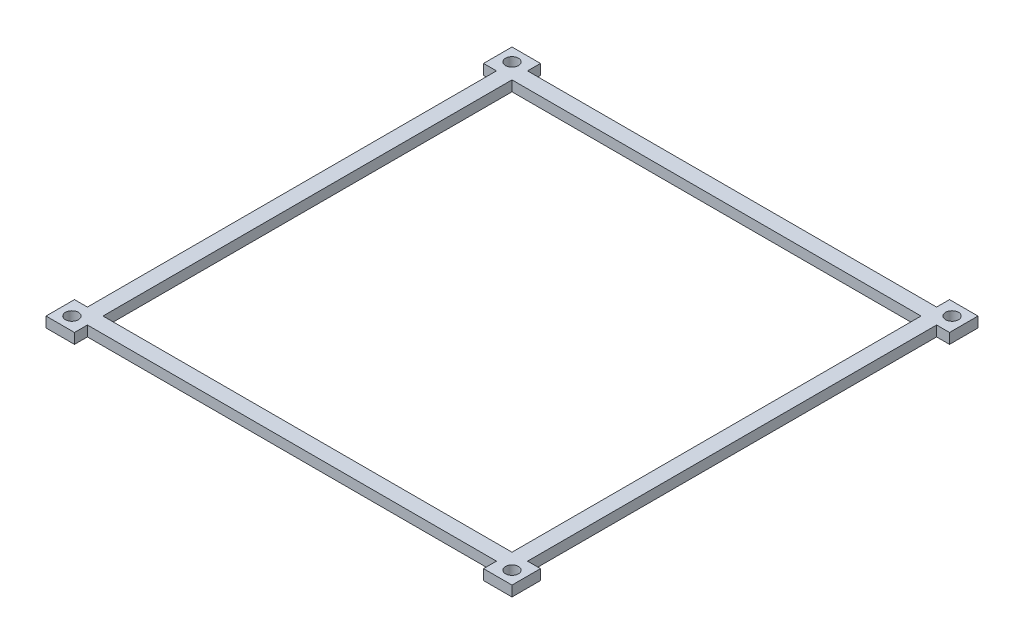
ISO-10303-21;
HEADER;
FILE_DESCRIPTION(('STEP AP214'),'2;1');
FILE_NAME('part.step','',(''),(''),'','','');
FILE_SCHEMA(('AUTOMOTIVE_DESIGN { 1 0 10303 214 1 1 1 1 }'));
ENDSEC;
DATA;
#1=APPLICATION_CONTEXT('core data for automotive mechanical design processes');
#2=APPLICATION_PROTOCOL_DEFINITION('international standard','automotive_design',2000,#1);
#3=PRODUCT_CONTEXT('',#1,'mechanical');
#4=PRODUCT('Part','Part','',(#3));
#5=PRODUCT_RELATED_PRODUCT_CATEGORY('part','',(#4));
#6=PRODUCT_DEFINITION_FORMATION('','',#4);
#7=PRODUCT_DEFINITION_CONTEXT('part definition',#1,'design');
#8=PRODUCT_DEFINITION('design','',#6,#7);
#9=PRODUCT_DEFINITION_SHAPE('','',#8);
#10=(LENGTH_UNIT() NAMED_UNIT(*) SI_UNIT(.MILLI.,.METRE.));
#11=(NAMED_UNIT(*) PLANE_ANGLE_UNIT() SI_UNIT($,.RADIAN.));
#12=(NAMED_UNIT(*) SI_UNIT($,.STERADIAN.) SOLID_ANGLE_UNIT());
#13=UNCERTAINTY_MEASURE_WITH_UNIT(LENGTH_MEASURE(1.E-05),#10,'distance_accuracy_value','');
#14=(GEOMETRIC_REPRESENTATION_CONTEXT(3) GLOBAL_UNCERTAINTY_ASSIGNED_CONTEXT((#13)) GLOBAL_UNIT_ASSIGNED_CONTEXT((#10,
#11,#12)) REPRESENTATION_CONTEXT('',''));
#15=CARTESIAN_POINT('',(0.,0.,0.));
#16=DIRECTION('',(0.,0.,1.));
#17=DIRECTION('',(1.,0.,0.));
#18=AXIS2_PLACEMENT_3D('',#15,#16,#17);
#19=CARTESIAN_POINT('',(9.99999999999997,-6.,-190.));
#20=DIRECTION('',(-1.,0.,0.));
#21=DIRECTION('',(0.,0.,1.));
#22=AXIS2_PLACEMENT_3D('',#19,#20,#21);
#23=PLANE('',#22);
#24=DIRECTION('',(0.,-1.,0.));
#25=VECTOR('',#24,1.);
#26=CARTESIAN_POINT('',(9.99999999999997,-6.,-179.000000000001));
#27=LINE('',#26,#25);
#28=CARTESIAN_POINT('',(10.0000000000032,4.,-179.000000000001));
#29=VERTEX_POINT('',#28);
#30=CARTESIAN_POINT('',(10.0000000000032,0.,-179.000000000001));
#31=VERTEX_POINT('',#30);
#32=EDGE_CURVE('E378',#29,#31,#27,.T.);
#33=ORIENTED_EDGE('',*,*,#32,.F.);
#34=DIRECTION('',(0.,0.,1.));
#35=VECTOR('',#34,1.);
#36=CARTESIAN_POINT('',(9.99999999999997,4.,-190.));
#37=LINE('',#36,#35);
#38=CARTESIAN_POINT('',(9.99999999999997,4.,-190.));
#39=VERTEX_POINT('',#38);
#40=EDGE_CURVE('E270',#39,#29,#37,.T.);
#41=ORIENTED_EDGE('',*,*,#40,.F.);
#42=DIRECTION('',(0.,1.,0.));
#43=VECTOR('',#42,1.);
#44=CARTESIAN_POINT('',(9.99999999999997,-6.,-190.));
#45=LINE('',#44,#43);
#46=CARTESIAN_POINT('',(9.99999999999997,0.,-190.));
#47=VERTEX_POINT('',#46);
#48=EDGE_CURVE('E285',#47,#39,#45,.T.);
#49=ORIENTED_EDGE('',*,*,#48,.F.);
#50=DIRECTION('',(0.,0.,-1.));
#51=VECTOR('',#50,1.);
#52=CARTESIAN_POINT('',(9.99999999999997,0.,0.));
#53=LINE('',#52,#51);
#54=EDGE_CURVE('E361',#31,#47,#53,.T.);
#55=ORIENTED_EDGE('',*,*,#54,.F.);
#56=EDGE_LOOP('',(#33,#41,#49,#55));
#57=FACE_BOUND('',#56,.T.);
#58=ADVANCED_FACE('F32',(#57),#23,.T.);
#59=CARTESIAN_POINT('',(190.,-6.,-190.));
#60=DIRECTION('',(0.,0.,-1.));
#61=DIRECTION('',(-1.,0.,0.));
#62=AXIS2_PLACEMENT_3D('',#59,#60,#61);
#63=PLANE('',#62);
#64=DIRECTION('',(0.,1.,0.));
#65=VECTOR('',#64,1.);
#66=CARTESIAN_POINT('',(21.,-6.,-190.));
#67=LINE('',#66,#65);
#68=CARTESIAN_POINT('',(21.,0.,-190.));
#69=VERTEX_POINT('',#68);
#70=CARTESIAN_POINT('',(21.,4.,-190.));
#71=VERTEX_POINT('',#70);
#72=EDGE_CURVE('E208',#69,#71,#67,.T.);
#73=ORIENTED_EDGE('',*,*,#72,.F.);
#74=DIRECTION('',(1.,0.,0.));
#75=VECTOR('',#74,1.);
#76=CARTESIAN_POINT('',(0.,0.,-190.));
#77=LINE('',#76,#75);
#78=EDGE_CURVE('E358',#47,#69,#77,.T.);
#79=ORIENTED_EDGE('',*,*,#78,.F.);
#80=ORIENTED_EDGE('',*,*,#48,.T.);
#81=DIRECTION('',(-1.,0.,0.));
#82=VECTOR('',#81,1.);
#83=CARTESIAN_POINT('',(190.,4.,-190.));
#84=LINE('',#83,#82);
#85=EDGE_CURVE('E281',#71,#39,#84,.T.);
#86=ORIENTED_EDGE('',*,*,#85,.F.);
#87=EDGE_LOOP('',(#73,#79,#80,#86));
#88=FACE_BOUND('',#87,.T.);
#89=ADVANCED_FACE('F462',(#88),#63,.T.);
#90=CARTESIAN_POINT('',(190.,-6.,-10.));
#91=DIRECTION('',(1.,0.,0.));
#92=DIRECTION('',(0.,0.,-1.));
#93=AXIS2_PLACEMENT_3D('',#90,#91,#92);
#94=PLANE('',#93);
#95=DIRECTION('',(0.,-1.,0.));
#96=VECTOR('',#95,1.);
#97=CARTESIAN_POINT('',(190.,-6.,-21.000000000002));
#98=LINE('',#97,#96);
#99=CARTESIAN_POINT('',(190.,4.,-21.000000000002));
#100=VERTEX_POINT('',#99);
#101=CARTESIAN_POINT('',(190.,0.,-21.000000000002));
#102=VERTEX_POINT('',#101);
#103=EDGE_CURVE('E371',#100,#102,#98,.T.);
#104=ORIENTED_EDGE('',*,*,#103,.F.);
#105=DIRECTION('',(0.,0.,-1.));
#106=VECTOR('',#105,1.);
#107=CARTESIAN_POINT('',(190.,4.,-10.));
#108=LINE('',#107,#106);
#109=CARTESIAN_POINT('',(190.,4.,-10.));
#110=VERTEX_POINT('',#109);
#111=EDGE_CURVE('E278',#110,#100,#108,.T.);
#112=ORIENTED_EDGE('',*,*,#111,.F.);
#113=DIRECTION('',(0.,1.,0.));
#114=VECTOR('',#113,1.);
#115=CARTESIAN_POINT('',(190.,-6.,-10.));
#116=LINE('',#115,#114);
#117=CARTESIAN_POINT('',(190.,0.,-10.));
#118=VERTEX_POINT('',#117);
#119=EDGE_CURVE('E292',#118,#110,#116,.T.);
#120=ORIENTED_EDGE('',*,*,#119,.F.);
#121=DIRECTION('',(0.,0.,1.));
#122=VECTOR('',#121,1.);
#123=CARTESIAN_POINT('',(190.,0.,0.));
#124=LINE('',#123,#122);
#125=EDGE_CURVE('E353',#102,#118,#124,.T.);
#126=ORIENTED_EDGE('',*,*,#125,.F.);
#127=EDGE_LOOP('',(#104,#112,#120,#126));
#128=FACE_BOUND('',#127,.T.);
#129=ADVANCED_FACE('F414',(#128),#94,.T.);
#130=CARTESIAN_POINT('',(9.99999999999997,-6.,-10.));
#131=DIRECTION('',(0.,0.,1.));
#132=DIRECTION('',(1.,0.,0.));
#133=AXIS2_PLACEMENT_3D('',#130,#131,#132);
#134=PLANE('',#133);
#135=DIRECTION('',(0.,-1.,0.));
#136=VECTOR('',#135,1.);
#137=CARTESIAN_POINT('',(21.0000000000018,-6.,-10.));
#138=LINE('',#137,#136);
#139=CARTESIAN_POINT('',(21.0000000000018,4.,-10.0000000000028));
#140=VERTEX_POINT('',#139);
#141=CARTESIAN_POINT('',(21.0000000000018,0.,-10.0000000000028));
#142=VERTEX_POINT('',#141);
#143=EDGE_CURVE('E367',#140,#142,#138,.T.);
#144=ORIENTED_EDGE('',*,*,#143,.F.);
#145=DIRECTION('',(1.,0.,0.));
#146=VECTOR('',#145,1.);
#147=CARTESIAN_POINT('',(9.99999999999997,4.,-10.));
#148=LINE('',#147,#146);
#149=CARTESIAN_POINT('',(9.99999999999997,4.,-10.));
#150=VERTEX_POINT('',#149);
#151=EDGE_CURVE('E274',#150,#140,#148,.T.);
#152=ORIENTED_EDGE('',*,*,#151,.F.);
#153=DIRECTION('',(0.,1.,0.));
#154=VECTOR('',#153,1.);
#155=CARTESIAN_POINT('',(9.99999999999997,-6.,-10.));
#156=LINE('',#155,#154);
#157=CARTESIAN_POINT('',(9.99999999999997,0.,-10.));
#158=VERTEX_POINT('',#157);
#159=EDGE_CURVE('E284',#158,#150,#156,.T.);
#160=ORIENTED_EDGE('',*,*,#159,.F.);
#161=DIRECTION('',(-1.,0.,0.));
#162=VECTOR('',#161,1.);
#163=CARTESIAN_POINT('',(0.,0.,-10.));
#164=LINE('',#163,#162);
#165=EDGE_CURVE('E349',#142,#158,#164,.T.);
#166=ORIENTED_EDGE('',*,*,#165,.F.);
#167=EDGE_LOOP('',(#144,#152,#160,#166));
#168=FACE_BOUND('',#167,.T.);
#169=ADVANCED_FACE('F438',(#168),#134,.T.);
#170=CARTESIAN_POINT('',(0.,4.,0.));
#171=DIRECTION('',(0.,-1.,0.));
#172=DIRECTION('',(0.,0.,-1.));
#173=AXIS2_PLACEMENT_3D('',#170,#171,#172);
#174=PLANE('',#173);
#175=CARTESIAN_POINT('',(15.,4.,-15.));
#176=DIRECTION('',(0.,1.,0.));
#177=DIRECTION('',(0.,0.,1.));
#178=AXIS2_PLACEMENT_3D('',#175,#176,#177);
#179=CIRCLE('',#178,2.5);
#180=CARTESIAN_POINT('',(15.,4.,-12.5));
#181=VERTEX_POINT('',#180);
#182=EDGE_CURVE('E317',#181,#181,#179,.T.);
#183=ORIENTED_EDGE('',*,*,#182,.F.);
#184=EDGE_LOOP('',(#183));
#185=FACE_BOUND('',#184,.T.);
#186=CARTESIAN_POINT('',(185.,4.,-15.0000000000001));
#187=DIRECTION('',(0.,1.,0.));
#188=DIRECTION('',(0.,0.,1.));
#189=AXIS2_PLACEMENT_3D('',#186,#187,#188);
#190=CIRCLE('',#189,2.5);
#191=CARTESIAN_POINT('',(185.,4.,-12.5000000000001));
#192=VERTEX_POINT('',#191);
#193=EDGE_CURVE('E323',#192,#192,#190,.T.);
#194=ORIENTED_EDGE('',*,*,#193,.F.);
#195=EDGE_LOOP('',(#194));
#196=FACE_BOUND('',#195,.T.);
#197=CARTESIAN_POINT('',(185.,4.,-185.));
#198=DIRECTION('',(0.,1.,0.));
#199=DIRECTION('',(0.,0.,1.));
#200=AXIS2_PLACEMENT_3D('',#197,#198,#199);
#201=CIRCLE('',#200,2.5);
#202=CARTESIAN_POINT('',(185.,4.,-182.5));
#203=VERTEX_POINT('',#202);
#204=EDGE_CURVE('E329',#203,#203,#201,.T.);
#205=ORIENTED_EDGE('',*,*,#204,.F.);
#206=EDGE_LOOP('',(#205));
#207=FACE_BOUND('',#206,.T.);
#208=CARTESIAN_POINT('',(15.,4.,-185.));
#209=DIRECTION('',(0.,1.,0.));
#210=DIRECTION('',(0.,0.,1.));
#211=AXIS2_PLACEMENT_3D('',#208,#209,#210);
#212=CIRCLE('',#211,2.5);
#213=CARTESIAN_POINT('',(15.,4.,-182.5));
#214=VERTEX_POINT('',#213);
#215=EDGE_CURVE('E335',#214,#214,#212,.T.);
#216=ORIENTED_EDGE('',*,*,#215,.F.);
#217=EDGE_LOOP('',(#216));
#218=FACE_BOUND('',#217,.T.);
#219=DIRECTION('',(-1.,0.,0.));
#220=VECTOR('',#219,1.);
#221=CARTESIAN_POINT('',(21.,4.,-179.));
#222=LINE('',#221,#220);
#223=CARTESIAN_POINT('',(179.,4.,-179.));
#224=VERTEX_POINT('',#223);
#225=CARTESIAN_POINT('',(21.,4.,-179.));
#226=VERTEX_POINT('',#225);
#227=EDGE_CURVE('E298',#224,#226,#222,.T.);
#228=ORIENTED_EDGE('',*,*,#227,.F.);
#229=DIRECTION('',(0.,0.,-1.));
#230=VECTOR('',#229,1.);
#231=CARTESIAN_POINT('',(179.,4.,-21.));
#232=LINE('',#231,#230);
#233=CARTESIAN_POINT('',(179.,4.,-21.));
#234=VERTEX_POINT('',#233);
#235=EDGE_CURVE('E288',#234,#224,#232,.T.);
#236=ORIENTED_EDGE('',*,*,#235,.F.);
#237=DIRECTION('',(1.,0.,0.));
#238=VECTOR('',#237,1.);
#239=CARTESIAN_POINT('',(21.,4.,-21.));
#240=LINE('',#239,#238);
#241=CARTESIAN_POINT('',(21.,4.,-21.));
#242=VERTEX_POINT('',#241);
#243=EDGE_CURVE('E304',#242,#234,#240,.T.);
#244=ORIENTED_EDGE('',*,*,#243,.F.);
#245=DIRECTION('',(0.,0.,1.));
#246=VECTOR('',#245,1.);
#247=CARTESIAN_POINT('',(21.,4.,-21.));
#248=LINE('',#247,#246);
#249=EDGE_CURVE('E301',#226,#242,#248,.T.);
#250=ORIENTED_EDGE('',*,*,#249,.F.);
#251=EDGE_LOOP('',(#228,#236,#244,#250));
#252=FACE_BOUND('',#251,.T.);
#253=DIRECTION('',(1.,0.,0.));
#254=VECTOR('',#253,1.);
#255=CARTESIAN_POINT('',(21.,4.,-185.));
#256=LINE('',#255,#254);
#257=CARTESIAN_POINT('',(21.,4.,-185.));
#258=VERTEX_POINT('',#257);
#259=CARTESIAN_POINT('',(179.,4.,-185.));
#260=VERTEX_POINT('',#259);
#261=EDGE_CURVE('E198',#258,#260,#256,.T.);
#262=ORIENTED_EDGE('',*,*,#261,.F.);
#263=DIRECTION('',(0.,0.,1.));
#264=VECTOR('',#263,1.);
#265=CARTESIAN_POINT('',(21.,4.,-190.));
#266=LINE('',#265,#264);
#267=EDGE_CURVE('E205',#71,#258,#266,.T.);
#268=ORIENTED_EDGE('',*,*,#267,.F.);
#269=ORIENTED_EDGE('',*,*,#85,.T.);
#270=ORIENTED_EDGE('',*,*,#40,.T.);
#271=DIRECTION('',(-1.,0.,0.));
#272=VECTOR('',#271,1.);
#273=CARTESIAN_POINT('',(10.0000000000032,4.,-179.000000000001));
#274=LINE('',#273,#272);
#275=CARTESIAN_POINT('',(15.0000000000032,4.,-179.000000000001));
#276=VERTEX_POINT('',#275);
#277=EDGE_CURVE('E250',#276,#29,#274,.T.);
#278=ORIENTED_EDGE('',*,*,#277,.F.);
#279=DIRECTION('',(0.,0.,-1.));
#280=VECTOR('',#279,1.);
#281=CARTESIAN_POINT('',(15.0000000000015,4.,-21.0000000000008));
#282=LINE('',#281,#280);
#283=CARTESIAN_POINT('',(15.0000000000015,4.,-21.0000000000008));
#284=VERTEX_POINT('',#283);
#285=EDGE_CURVE('E247',#284,#276,#282,.T.);
#286=ORIENTED_EDGE('',*,*,#285,.F.);
#287=DIRECTION('',(1.,0.,0.));
#288=VECTOR('',#287,1.);
#289=CARTESIAN_POINT('',(10.0000000000015,4.,-21.0000000000009));
#290=LINE('',#289,#288);
#291=CARTESIAN_POINT('',(10.0000000000015,4.,-21.0000000000009));
#292=VERTEX_POINT('',#291);
#293=EDGE_CURVE('E244',#292,#284,#290,.T.);
#294=ORIENTED_EDGE('',*,*,#293,.F.);
#295=EDGE_CURVE('E269',#292,#150,#37,.T.);
#296=ORIENTED_EDGE('',*,*,#295,.T.);
#297=ORIENTED_EDGE('',*,*,#151,.T.);
#298=DIRECTION('',(0.,0.,1.));
#299=VECTOR('',#298,1.);
#300=CARTESIAN_POINT('',(21.0000000000018,4.,-10.0000000000028));
#301=LINE('',#300,#299);
#302=CARTESIAN_POINT('',(21.0000000000018,4.,-15.0000000000028));
#303=VERTEX_POINT('',#302);
#304=EDGE_CURVE('E239',#303,#140,#301,.T.);
#305=ORIENTED_EDGE('',*,*,#304,.F.);
#306=DIRECTION('',(-1.,0.,0.));
#307=VECTOR('',#306,1.);
#308=CARTESIAN_POINT('',(179.000000000002,4.,-15.0000000000017));
#309=LINE('',#308,#307);
#310=CARTESIAN_POINT('',(179.000000000002,4.,-15.0000000000017));
#311=VERTEX_POINT('',#310);
#312=EDGE_CURVE('E235',#311,#303,#309,.T.);
#313=ORIENTED_EDGE('',*,*,#312,.F.);
#314=DIRECTION('',(0.,0.,-1.));
#315=VECTOR('',#314,1.);
#316=CARTESIAN_POINT('',(179.000000000002,4.,-10.0000000000017));
#317=LINE('',#316,#315);
#318=CARTESIAN_POINT('',(179.000000000002,4.,-10.0000000000017));
#319=VERTEX_POINT('',#318);
#320=EDGE_CURVE('E232',#319,#311,#317,.T.);
#321=ORIENTED_EDGE('',*,*,#320,.F.);
#322=EDGE_CURVE('E273',#319,#110,#148,.T.);
#323=ORIENTED_EDGE('',*,*,#322,.T.);
#324=ORIENTED_EDGE('',*,*,#111,.T.);
#325=DIRECTION('',(1.,0.,0.));
#326=VECTOR('',#325,1.);
#327=CARTESIAN_POINT('',(190.,4.,-21.000000000002));
#328=LINE('',#327,#326);
#329=CARTESIAN_POINT('',(185.,4.,-21.0000000000021));
#330=VERTEX_POINT('',#329);
#331=EDGE_CURVE('E227',#330,#100,#328,.T.);
#332=ORIENTED_EDGE('',*,*,#331,.F.);
#333=DIRECTION('',(0.,0.,1.));
#334=VECTOR('',#333,1.);
#335=CARTESIAN_POINT('',(185.,4.,-179.000000000002));
#336=LINE('',#335,#334);
#337=CARTESIAN_POINT('',(185.,4.,-179.000000000002));
#338=VERTEX_POINT('',#337);
#339=EDGE_CURVE('E223',#338,#330,#336,.T.);
#340=ORIENTED_EDGE('',*,*,#339,.F.);
#341=DIRECTION('',(-1.,0.,0.));
#342=VECTOR('',#341,1.);
#343=CARTESIAN_POINT('',(190.,4.,-179.000000000002));
#344=LINE('',#343,#342);
#345=CARTESIAN_POINT('',(190.,4.,-179.000000000002));
#346=VERTEX_POINT('',#345);
#347=EDGE_CURVE('E220',#346,#338,#344,.T.);
#348=ORIENTED_EDGE('',*,*,#347,.F.);
#349=CARTESIAN_POINT('',(190.,4.,-190.));
#350=VERTEX_POINT('',#349);
#351=EDGE_CURVE('E277',#346,#350,#108,.T.);
#352=ORIENTED_EDGE('',*,*,#351,.T.);
#353=CARTESIAN_POINT('',(179.,4.,-190.));
#354=VERTEX_POINT('',#353);
#355=EDGE_CURVE('E282',#350,#354,#84,.T.);
#356=ORIENTED_EDGE('',*,*,#355,.T.);
#357=DIRECTION('',(0.,0.,-1.));
#358=VECTOR('',#357,1.);
#359=CARTESIAN_POINT('',(179.,4.,-190.));
#360=LINE('',#359,#358);
#361=EDGE_CURVE('E55',#260,#354,#360,.T.);
#362=ORIENTED_EDGE('',*,*,#361,.F.);
#363=EDGE_LOOP('',(#262,#268,#269,#270,#278,#286,#294,#296,#297,#305,#313,#321,#323,#324,#332,
#340,#348,#352,#356,#362));
#364=FACE_BOUND('',#363,.T.);
#365=ADVANCED_FACE('F213',(#185,#196,#207,#218,#252,#364),#174,.F.);
#366=CARTESIAN_POINT('',(0.,0.,0.));
#367=DIRECTION('',(0.,-1.,0.));
#368=DIRECTION('',(0.,0.,-1.));
#369=AXIS2_PLACEMENT_3D('',#366,#367,#368);
#370=PLANE('',#369);
#371=DIRECTION('',(0.,0.,-1.));
#372=VECTOR('',#371,1.);
#373=CARTESIAN_POINT('',(21.,0.,0.));
#374=LINE('',#373,#372);
#375=CARTESIAN_POINT('',(21.,0.,-185.));
#376=VERTEX_POINT('',#375);
#377=EDGE_CURVE('E264',#376,#69,#374,.T.);
#378=ORIENTED_EDGE('',*,*,#377,.F.);
#379=DIRECTION('',(-1.,0.,0.));
#380=VECTOR('',#379,1.);
#381=CARTESIAN_POINT('',(0.,0.,-185.));
#382=LINE('',#381,#380);
#383=CARTESIAN_POINT('',(179.,0.,-185.));
#384=VERTEX_POINT('',#383);
#385=EDGE_CURVE('E11',#384,#376,#382,.T.);
#386=ORIENTED_EDGE('',*,*,#385,.F.);
#387=DIRECTION('',(0.,0.,1.));
#388=VECTOR('',#387,1.);
#389=CARTESIAN_POINT('',(179.,0.,0.));
#390=LINE('',#389,#388);
#391=CARTESIAN_POINT('',(179.,0.,-190.));
#392=VERTEX_POINT('',#391);
#393=EDGE_CURVE('E262',#392,#384,#390,.T.);
#394=ORIENTED_EDGE('',*,*,#393,.F.);
#395=CARTESIAN_POINT('',(190.,0.,-190.));
#396=VERTEX_POINT('',#395);
#397=EDGE_CURVE('E357',#392,#396,#77,.T.);
#398=ORIENTED_EDGE('',*,*,#397,.T.);
#399=CARTESIAN_POINT('',(190.,0.,-179.000000000002));
#400=VERTEX_POINT('',#399);
#401=EDGE_CURVE('E354',#396,#400,#124,.T.);
#402=ORIENTED_EDGE('',*,*,#401,.T.);
#403=DIRECTION('',(1.,0.,0.));
#404=VECTOR('',#403,1.);
#405=CARTESIAN_POINT('',(9.93649607039531E-13,0.,-179.000000000003));
#406=LINE('',#405,#404);
#407=CARTESIAN_POINT('',(185.,0.,-179.000000000002));
#408=VERTEX_POINT('',#407);
#409=EDGE_CURVE('E258',#408,#400,#406,.T.);
#410=ORIENTED_EDGE('',*,*,#409,.F.);
#411=DIRECTION('',(0.,0.,-1.));
#412=VECTOR('',#411,1.);
#413=CARTESIAN_POINT('',(185.,0.,6.49972340365993E-13));
#414=LINE('',#413,#412);
#415=CARTESIAN_POINT('',(185.,0.,-21.0000000000021));
#416=VERTEX_POINT('',#415);
#417=EDGE_CURVE('E40',#416,#408,#414,.T.);
#418=ORIENTED_EDGE('',*,*,#417,.F.);
#419=DIRECTION('',(-1.,0.,0.));
#420=VECTOR('',#419,1.);
#421=CARTESIAN_POINT('',(1.16573417585659E-13,0.,-21.0000000000031));
#422=LINE('',#421,#420);
#423=EDGE_CURVE('E260',#102,#416,#422,.T.);
#424=ORIENTED_EDGE('',*,*,#423,.F.);
#425=ORIENTED_EDGE('',*,*,#125,.T.);
#426=CARTESIAN_POINT('',(179.000000000002,0.,-10.));
#427=VERTEX_POINT('',#426);
#428=EDGE_CURVE('E350',#118,#427,#164,.T.);
#429=ORIENTED_EDGE('',*,*,#428,.T.);
#430=DIRECTION('',(0.,0.,1.));
#431=VECTOR('',#430,1.);
#432=CARTESIAN_POINT('',(179.000000000002,0.,9.93649607039524E-13));
#433=LINE('',#432,#431);
#434=CARTESIAN_POINT('',(179.000000000002,0.,-15.0000000000017));
#435=VERTEX_POINT('',#434);
#436=EDGE_CURVE('E218',#435,#427,#433,.T.);
#437=ORIENTED_EDGE('',*,*,#436,.F.);
#438=DIRECTION('',(1.,0.,0.));
#439=VECTOR('',#438,1.);
#440=CARTESIAN_POINT('',(1.05400920059371E-13,0.,-15.0000000000029));
#441=LINE('',#440,#439);
#442=CARTESIAN_POINT('',(21.0000000000018,0.,-15.0000000000028));
#443=VERTEX_POINT('',#442);
#444=EDGE_CURVE('E382',#443,#435,#441,.T.);
#445=ORIENTED_EDGE('',*,*,#444,.F.);
#446=DIRECTION('',(0.,0.,-1.));
#447=VECTOR('',#446,1.);
#448=CARTESIAN_POINT('',(21.0000000000017,0.,1.16573417585651E-13));
#449=LINE('',#448,#447);
#450=EDGE_CURVE('E256',#142,#443,#449,.T.);
#451=ORIENTED_EDGE('',*,*,#450,.F.);
#452=ORIENTED_EDGE('',*,*,#165,.T.);
#453=CARTESIAN_POINT('',(9.99999999999997,0.,-21.0000000000009));
#454=VERTEX_POINT('',#453);
#455=EDGE_CURVE('E362',#158,#454,#53,.T.);
#456=ORIENTED_EDGE('',*,*,#455,.T.);
#457=DIRECTION('',(-1.,0.,0.));
#458=VECTOR('',#457,1.);
#459=CARTESIAN_POINT('',(2.04003480774882E-13,0.,-21.000000000001));
#460=LINE('',#459,#458);
#461=CARTESIAN_POINT('',(15.0000000000015,0.,-21.0000000000008));
#462=VERTEX_POINT('',#461);
#463=EDGE_CURVE('E47',#462,#454,#460,.T.);
#464=ORIENTED_EDGE('',*,*,#463,.F.);
#465=DIRECTION('',(0.,0.,1.));
#466=VECTOR('',#465,1.);
#467=CARTESIAN_POINT('',(15.0000000000013,0.,1.58101380089039E-13));
#468=LINE('',#467,#466);
#469=CARTESIAN_POINT('',(15.0000000000032,0.,-179.000000000001));
#470=VERTEX_POINT('',#469);
#471=EDGE_CURVE('E380',#470,#462,#468,.T.);
#472=ORIENTED_EDGE('',*,*,#471,.F.);
#473=DIRECTION('',(1.,0.,0.));
#474=VECTOR('',#473,1.);
#475=CARTESIAN_POINT('',(1.98729921407904E-12,0.,-179.000000000001));
#476=LINE('',#475,#474);
#477=EDGE_CURVE('E267',#31,#470,#476,.T.);
#478=ORIENTED_EDGE('',*,*,#477,.F.);
#479=ORIENTED_EDGE('',*,*,#54,.T.);
#480=ORIENTED_EDGE('',*,*,#78,.T.);
#481=EDGE_LOOP('',(#378,#386,#394,#398,#402,#410,#418,#424,#425,#429,#437,#445,#451,#452,#456,
#464,#472,#478,#479,#480));
#482=FACE_BOUND('',#481,.T.);
#483=CARTESIAN_POINT('',(15.,0.,-15.));
#484=DIRECTION('',(0.,1.,0.));
#485=DIRECTION('',(0.,0.,1.));
#486=AXIS2_PLACEMENT_3D('',#483,#484,#485);
#487=CIRCLE('',#486,2.5);
#488=CARTESIAN_POINT('',(15.,0.,-12.5));
#489=VERTEX_POINT('',#488);
#490=EDGE_CURVE('E310',#489,#489,#487,.T.);
#491=ORIENTED_EDGE('',*,*,#490,.T.);
#492=EDGE_LOOP('',(#491));
#493=FACE_BOUND('',#492,.T.);
#494=CARTESIAN_POINT('',(185.,0.,-185.));
#495=DIRECTION('',(0.,1.,0.));
#496=DIRECTION('',(0.,0.,1.));
#497=AXIS2_PLACEMENT_3D('',#494,#495,#496);
#498=CIRCLE('',#497,2.5);
#499=CARTESIAN_POINT('',(185.,0.,-182.5));
#500=VERTEX_POINT('',#499);
#501=EDGE_CURVE('E326',#500,#500,#498,.T.);
#502=ORIENTED_EDGE('',*,*,#501,.T.);
#503=EDGE_LOOP('',(#502));
#504=FACE_BOUND('',#503,.T.);
#505=CARTESIAN_POINT('',(15.,0.,-185.));
#506=DIRECTION('',(0.,1.,0.));
#507=DIRECTION('',(0.,0.,1.));
#508=AXIS2_PLACEMENT_3D('',#505,#506,#507);
#509=CIRCLE('',#508,2.5);
#510=CARTESIAN_POINT('',(15.,0.,-182.5));
#511=VERTEX_POINT('',#510);
#512=EDGE_CURVE('E332',#511,#511,#509,.T.);
#513=ORIENTED_EDGE('',*,*,#512,.T.);
#514=EDGE_LOOP('',(#513));
#515=FACE_BOUND('',#514,.T.);
#516=CARTESIAN_POINT('',(185.,0.,-15.0000000000001));
#517=DIRECTION('',(0.,1.,0.));
#518=DIRECTION('',(0.,0.,1.));
#519=AXIS2_PLACEMENT_3D('',#516,#517,#518);
#520=CIRCLE('',#519,2.5);
#521=CARTESIAN_POINT('',(185.,0.,-12.5000000000001));
#522=VERTEX_POINT('',#521);
#523=EDGE_CURVE('E320',#522,#522,#520,.T.);
#524=ORIENTED_EDGE('',*,*,#523,.T.);
#525=EDGE_LOOP('',(#524));
#526=FACE_BOUND('',#525,.T.);
#527=DIRECTION('',(0.,0.,1.));
#528=VECTOR('',#527,1.);
#529=CARTESIAN_POINT('',(179.,0.,0.));
#530=LINE('',#529,#528);
#531=CARTESIAN_POINT('',(179.,0.,-179.));
#532=VERTEX_POINT('',#531);
#533=CARTESIAN_POINT('',(179.,0.,-21.));
#534=VERTEX_POINT('',#533);
#535=EDGE_CURVE('E347',#532,#534,#530,.T.);
#536=ORIENTED_EDGE('',*,*,#535,.F.);
#537=DIRECTION('',(1.,0.,0.));
#538=VECTOR('',#537,1.);
#539=CARTESIAN_POINT('',(0.,0.,-179.));
#540=LINE('',#539,#538);
#541=CARTESIAN_POINT('',(21.,0.,-179.));
#542=VERTEX_POINT('',#541);
#543=EDGE_CURVE('E338',#542,#532,#540,.T.);
#544=ORIENTED_EDGE('',*,*,#543,.F.);
#545=DIRECTION('',(0.,0.,-1.));
#546=VECTOR('',#545,1.);
#547=CARTESIAN_POINT('',(21.,0.,0.));
#548=LINE('',#547,#546);
#549=CARTESIAN_POINT('',(21.,0.,-21.));
#550=VERTEX_POINT('',#549);
#551=EDGE_CURVE('E342',#550,#542,#548,.T.);
#552=ORIENTED_EDGE('',*,*,#551,.F.);
#553=DIRECTION('',(-1.,0.,0.));
#554=VECTOR('',#553,1.);
#555=CARTESIAN_POINT('',(0.,0.,-21.));
#556=LINE('',#555,#554);
#557=EDGE_CURVE('E345',#534,#550,#556,.T.);
#558=ORIENTED_EDGE('',*,*,#557,.F.);
#559=EDGE_LOOP('',(#536,#544,#552,#558));
#560=FACE_BOUND('',#559,.T.);
#561=ADVANCED_FACE('F34',(#482,#493,#504,#515,#526,#560),#370,.T.);
#562=CARTESIAN_POINT('',(15.,4.,-185.));
#563=DIRECTION('',(0.,-1.,0.));
#564=DIRECTION('',(0.,0.,-1.));
#565=AXIS2_PLACEMENT_3D('',#562,#563,#564);
#566=CYLINDRICAL_SURFACE('',#565,2.5);
#567=ORIENTED_EDGE('',*,*,#215,.T.);
#568=EDGE_LOOP('',(#567));
#569=FACE_BOUND('',#568,.T.);
#570=ORIENTED_EDGE('',*,*,#512,.F.);
#571=EDGE_LOOP('',(#570));
#572=FACE_BOUND('',#571,.T.);
#573=ADVANCED_FACE('F508',(#569,#572),#566,.F.);
#574=CARTESIAN_POINT('',(185.,4.,-185.));
#575=DIRECTION('',(0.,-1.,0.));
#576=DIRECTION('',(0.,0.,-1.));
#577=AXIS2_PLACEMENT_3D('',#574,#575,#576);
#578=CYLINDRICAL_SURFACE('',#577,2.5);
#579=ORIENTED_EDGE('',*,*,#204,.T.);
#580=EDGE_LOOP('',(#579));
#581=FACE_BOUND('',#580,.T.);
#582=ORIENTED_EDGE('',*,*,#501,.F.);
#583=EDGE_LOOP('',(#582));
#584=FACE_BOUND('',#583,.T.);
#585=ADVANCED_FACE('F504',(#581,#584),#578,.F.);
#586=CARTESIAN_POINT('',(185.,4.,-15.0000000000001));
#587=DIRECTION('',(0.,-1.,0.));
#588=DIRECTION('',(0.,0.,-1.));
#589=AXIS2_PLACEMENT_3D('',#586,#587,#588);
#590=CYLINDRICAL_SURFACE('',#589,2.5);
#591=ORIENTED_EDGE('',*,*,#193,.T.);
#592=EDGE_LOOP('',(#591));
#593=FACE_BOUND('',#592,.T.);
#594=ORIENTED_EDGE('',*,*,#523,.F.);
#595=EDGE_LOOP('',(#594));
#596=FACE_BOUND('',#595,.T.);
#597=ADVANCED_FACE('F500',(#593,#596),#590,.F.);
#598=CARTESIAN_POINT('',(15.,4.,-15.));
#599=DIRECTION('',(0.,-1.,0.));
#600=DIRECTION('',(0.,0.,-1.));
#601=AXIS2_PLACEMENT_3D('',#598,#599,#600);
#602=CYLINDRICAL_SURFACE('',#601,2.5);
#603=ORIENTED_EDGE('',*,*,#182,.T.);
#604=EDGE_LOOP('',(#603));
#605=FACE_BOUND('',#604,.T.);
#606=ORIENTED_EDGE('',*,*,#490,.F.);
#607=EDGE_LOOP('',(#606));
#608=FACE_BOUND('',#607,.T.);
#609=ADVANCED_FACE('F496',(#605,#608),#602,.F.);
#610=CARTESIAN_POINT('',(179.,-6.,-21.));
#611=DIRECTION('',(1.,0.,0.));
#612=DIRECTION('',(0.,0.,-1.));
#613=AXIS2_PLACEMENT_3D('',#610,#611,#612);
#614=PLANE('',#613);
#615=ORIENTED_EDGE('',*,*,#535,.T.);
#616=DIRECTION('',(0.,1.,0.));
#617=VECTOR('',#616,1.);
#618=CARTESIAN_POINT('',(179.,-6.,-21.));
#619=LINE('',#618,#617);
#620=EDGE_CURVE('E308',#534,#234,#619,.T.);
#621=ORIENTED_EDGE('',*,*,#620,.T.);
#622=ORIENTED_EDGE('',*,*,#235,.T.);
#623=DIRECTION('',(0.,1.,0.));
#624=VECTOR('',#623,1.);
#625=CARTESIAN_POINT('',(179.,-6.,-179.));
#626=LINE('',#625,#624);
#627=EDGE_CURVE('E307',#532,#224,#626,.T.);
#628=ORIENTED_EDGE('',*,*,#627,.F.);
#629=EDGE_LOOP('',(#615,#621,#622,#628));
#630=FACE_BOUND('',#629,.T.);
#631=ADVANCED_FACE('F489',(#630),#614,.F.);
#632=CARTESIAN_POINT('',(21.,-6.,-21.));
#633=DIRECTION('',(0.,0.,1.));
#634=DIRECTION('',(1.,0.,0.));
#635=AXIS2_PLACEMENT_3D('',#632,#633,#634);
#636=PLANE('',#635);
#637=ORIENTED_EDGE('',*,*,#557,.T.);
#638=DIRECTION('',(0.,1.,0.));
#639=VECTOR('',#638,1.);
#640=CARTESIAN_POINT('',(21.,-6.,-21.));
#641=LINE('',#640,#639);
#642=EDGE_CURVE('E311',#550,#242,#641,.T.);
#643=ORIENTED_EDGE('',*,*,#642,.T.);
#644=ORIENTED_EDGE('',*,*,#243,.T.);
#645=ORIENTED_EDGE('',*,*,#620,.F.);
#646=EDGE_LOOP('',(#637,#643,#644,#645));
#647=FACE_BOUND('',#646,.T.);
#648=ADVANCED_FACE('F486',(#647),#636,.F.);
#649=CARTESIAN_POINT('',(21.,-6.,-21.));
#650=DIRECTION('',(-1.,0.,0.));
#651=DIRECTION('',(0.,0.,1.));
#652=AXIS2_PLACEMENT_3D('',#649,#650,#651);
#653=PLANE('',#652);
#654=ORIENTED_EDGE('',*,*,#551,.T.);
#655=DIRECTION('',(0.,1.,0.));
#656=VECTOR('',#655,1.);
#657=CARTESIAN_POINT('',(21.,-6.,-179.));
#658=LINE('',#657,#656);
#659=EDGE_CURVE('E313',#542,#226,#658,.T.);
#660=ORIENTED_EDGE('',*,*,#659,.T.);
#661=ORIENTED_EDGE('',*,*,#249,.T.);
#662=ORIENTED_EDGE('',*,*,#642,.F.);
#663=EDGE_LOOP('',(#654,#660,#661,#662));
#664=FACE_BOUND('',#663,.T.);
#665=ADVANCED_FACE('F481',(#664),#653,.F.);
#666=CARTESIAN_POINT('',(21.,-6.,-179.));
#667=DIRECTION('',(0.,0.,-1.));
#668=DIRECTION('',(-1.,0.,0.));
#669=AXIS2_PLACEMENT_3D('',#666,#667,#668);
#670=PLANE('',#669);
#671=ORIENTED_EDGE('',*,*,#543,.T.);
#672=ORIENTED_EDGE('',*,*,#627,.T.);
#673=ORIENTED_EDGE('',*,*,#227,.T.);
#674=ORIENTED_EDGE('',*,*,#659,.F.);
#675=EDGE_LOOP('',(#671,#672,#673,#674));
#676=FACE_BOUND('',#675,.T.);
#677=ADVANCED_FACE('F477',(#676),#670,.F.);
#678=DIRECTION('',(0.,1.,0.));
#679=VECTOR('',#678,1.);
#680=CARTESIAN_POINT('',(9.99999999999997,-6.,-21.0000000000009));
#681=LINE('',#680,#679);
#682=EDGE_CURVE('E376',#454,#292,#681,.T.);
#683=ORIENTED_EDGE('',*,*,#682,.F.);
#684=ORIENTED_EDGE('',*,*,#455,.F.);
#685=ORIENTED_EDGE('',*,*,#159,.T.);
#686=ORIENTED_EDGE('',*,*,#295,.F.);
#687=EDGE_LOOP('',(#683,#684,#685,#686));
#688=FACE_BOUND('',#687,.T.);
#689=ADVANCED_FACE('F443',(#688),#23,.T.);
#690=DIRECTION('',(0.,-1.,0.));
#691=VECTOR('',#690,1.);
#692=CARTESIAN_POINT('',(179.,-6.,-190.));
#693=LINE('',#692,#691);
#694=EDGE_CURVE('E373',#354,#392,#693,.T.);
#695=ORIENTED_EDGE('',*,*,#694,.F.);
#696=ORIENTED_EDGE('',*,*,#355,.F.);
#697=DIRECTION('',(0.,1.,0.));
#698=VECTOR('',#697,1.);
#699=CARTESIAN_POINT('',(190.,-6.,-190.));
#700=LINE('',#699,#698);
#701=EDGE_CURVE('E289',#396,#350,#700,.T.);
#702=ORIENTED_EDGE('',*,*,#701,.F.);
#703=ORIENTED_EDGE('',*,*,#397,.F.);
#704=EDGE_LOOP('',(#695,#696,#702,#703));
#705=FACE_BOUND('',#704,.T.);
#706=ADVANCED_FACE('F406',(#705),#63,.T.);
#707=DIRECTION('',(0.,1.,0.));
#708=VECTOR('',#707,1.);
#709=CARTESIAN_POINT('',(190.,-6.,-179.000000000002));
#710=LINE('',#709,#708);
#711=EDGE_CURVE('E369',#400,#346,#710,.T.);
#712=ORIENTED_EDGE('',*,*,#711,.F.);
#713=ORIENTED_EDGE('',*,*,#401,.F.);
#714=ORIENTED_EDGE('',*,*,#701,.T.);
#715=ORIENTED_EDGE('',*,*,#351,.F.);
#716=EDGE_LOOP('',(#712,#713,#714,#715));
#717=FACE_BOUND('',#716,.T.);
#718=ADVANCED_FACE('F402',(#717),#94,.T.);
#719=DIRECTION('',(0.,1.,0.));
#720=VECTOR('',#719,1.);
#721=CARTESIAN_POINT('',(179.000000000002,-6.,-10.));
#722=LINE('',#721,#720);
#723=EDGE_CURVE('E365',#427,#319,#722,.T.);
#724=ORIENTED_EDGE('',*,*,#723,.F.);
#725=ORIENTED_EDGE('',*,*,#428,.F.);
#726=ORIENTED_EDGE('',*,*,#119,.T.);
#727=ORIENTED_EDGE('',*,*,#322,.F.);
#728=EDGE_LOOP('',(#724,#725,#726,#727));
#729=FACE_BOUND('',#728,.T.);
#730=ADVANCED_FACE('F420',(#729),#134,.T.);
#731=CARTESIAN_POINT('',(21.0000000000018,-6.,-10.0000000000028));
#732=DIRECTION('',(-1.,0.,0.));
#733=DIRECTION('',(0.,0.,1.));
#734=AXIS2_PLACEMENT_3D('',#731,#732,#733);
#735=PLANE('',#734);
#736=ORIENTED_EDGE('',*,*,#450,.T.);
#737=DIRECTION('',(0.,1.,0.));
#738=VECTOR('',#737,1.);
#739=CARTESIAN_POINT('',(21.0000000000018,-6.,-15.0000000000028));
#740=LINE('',#739,#738);
#741=EDGE_CURVE('E224',#443,#303,#740,.T.);
#742=ORIENTED_EDGE('',*,*,#741,.T.);
#743=ORIENTED_EDGE('',*,*,#304,.T.);
#744=ORIENTED_EDGE('',*,*,#143,.T.);
#745=EDGE_LOOP('',(#736,#742,#743,#744));
#746=FACE_BOUND('',#745,.T.);
#747=ADVANCED_FACE('F552',(#746),#735,.F.);
#748=CARTESIAN_POINT('',(179.000000000002,-6.,-15.0000000000017));
#749=DIRECTION('',(0.,0.,-1.));
#750=DIRECTION('',(-1.,0.,0.));
#751=AXIS2_PLACEMENT_3D('',#748,#749,#750);
#752=PLANE('',#751);
#753=ORIENTED_EDGE('',*,*,#444,.T.);
#754=DIRECTION('',(0.,1.,0.));
#755=VECTOR('',#754,1.);
#756=CARTESIAN_POINT('',(179.000000000002,-6.,-15.0000000000017));
#757=LINE('',#756,#755);
#758=EDGE_CURVE('E241',#435,#311,#757,.T.);
#759=ORIENTED_EDGE('',*,*,#758,.T.);
#760=ORIENTED_EDGE('',*,*,#312,.T.);
#761=ORIENTED_EDGE('',*,*,#741,.F.);
#762=EDGE_LOOP('',(#753,#759,#760,#761));
#763=FACE_BOUND('',#762,.T.);
#764=ADVANCED_FACE('F430',(#763),#752,.F.);
#765=CARTESIAN_POINT('',(179.000000000002,-6.,-10.0000000000017));
#766=DIRECTION('',(1.,0.,0.));
#767=DIRECTION('',(0.,0.,-1.));
#768=AXIS2_PLACEMENT_3D('',#765,#766,#767);
#769=PLANE('',#768);
#770=ORIENTED_EDGE('',*,*,#436,.T.);
#771=ORIENTED_EDGE('',*,*,#723,.T.);
#772=ORIENTED_EDGE('',*,*,#320,.T.);
#773=ORIENTED_EDGE('',*,*,#758,.F.);
#774=EDGE_LOOP('',(#770,#771,#772,#773));
#775=FACE_BOUND('',#774,.T.);
#776=ADVANCED_FACE('F424',(#775),#769,.F.);
#777=CARTESIAN_POINT('',(190.,-6.,-21.000000000002));
#778=DIRECTION('',(0.,0.,1.));
#779=DIRECTION('',(1.,0.,0.));
#780=AXIS2_PLACEMENT_3D('',#777,#778,#779);
#781=PLANE('',#780);
#782=ORIENTED_EDGE('',*,*,#423,.T.);
#783=DIRECTION('',(0.,1.,0.));
#784=VECTOR('',#783,1.);
#785=CARTESIAN_POINT('',(185.,-6.,-21.0000000000021));
#786=LINE('',#785,#784);
#787=EDGE_CURVE('E211',#416,#330,#786,.T.);
#788=ORIENTED_EDGE('',*,*,#787,.T.);
#789=ORIENTED_EDGE('',*,*,#331,.T.);
#790=ORIENTED_EDGE('',*,*,#103,.T.);
#791=EDGE_LOOP('',(#782,#788,#789,#790));
#792=FACE_BOUND('',#791,.T.);
#793=ADVANCED_FACE('F411',(#792),#781,.F.);
#794=CARTESIAN_POINT('',(185.,-6.,-179.000000000002));
#795=DIRECTION('',(-1.,0.,0.));
#796=DIRECTION('',(0.,0.,1.));
#797=AXIS2_PLACEMENT_3D('',#794,#795,#796);
#798=PLANE('',#797);
#799=ORIENTED_EDGE('',*,*,#417,.T.);
#800=DIRECTION('',(0.,1.,0.));
#801=VECTOR('',#800,1.);
#802=CARTESIAN_POINT('',(185.,-6.,-179.000000000002));
#803=LINE('',#802,#801);
#804=EDGE_CURVE('E229',#408,#338,#803,.T.);
#805=ORIENTED_EDGE('',*,*,#804,.T.);
#806=ORIENTED_EDGE('',*,*,#339,.T.);
#807=ORIENTED_EDGE('',*,*,#787,.F.);
#808=EDGE_LOOP('',(#799,#805,#806,#807));
#809=FACE_BOUND('',#808,.T.);
#810=ADVANCED_FACE('F387',(#809),#798,.F.);
#811=CARTESIAN_POINT('',(190.,-6.,-179.000000000002));
#812=DIRECTION('',(0.,0.,-1.));
#813=DIRECTION('',(-1.,0.,0.));
#814=AXIS2_PLACEMENT_3D('',#811,#812,#813);
#815=PLANE('',#814);
#816=ORIENTED_EDGE('',*,*,#409,.T.);
#817=ORIENTED_EDGE('',*,*,#711,.T.);
#818=ORIENTED_EDGE('',*,*,#347,.T.);
#819=ORIENTED_EDGE('',*,*,#804,.F.);
#820=EDGE_LOOP('',(#816,#817,#818,#819));
#821=FACE_BOUND('',#820,.T.);
#822=ADVANCED_FACE('F392',(#821),#815,.F.);
#823=CARTESIAN_POINT('',(21.,-6.,-190.));
#824=DIRECTION('',(-1.,0.,0.));
#825=DIRECTION('',(0.,0.,1.));
#826=AXIS2_PLACEMENT_3D('',#823,#824,#825);
#827=PLANE('',#826);
#828=ORIENTED_EDGE('',*,*,#377,.T.);
#829=ORIENTED_EDGE('',*,*,#72,.T.);
#830=ORIENTED_EDGE('',*,*,#267,.T.);
#831=DIRECTION('',(0.,1.,0.));
#832=VECTOR('',#831,1.);
#833=CARTESIAN_POINT('',(21.,-6.,-185.));
#834=LINE('',#833,#832);
#835=EDGE_CURVE('E193',#376,#258,#834,.T.);
#836=ORIENTED_EDGE('',*,*,#835,.F.);
#837=EDGE_LOOP('',(#828,#829,#830,#836));
#838=FACE_BOUND('',#837,.T.);
#839=ADVANCED_FACE('F206',(#838),#827,.F.);
#840=CARTESIAN_POINT('',(179.,-6.,-190.));
#841=DIRECTION('',(1.,0.,0.));
#842=DIRECTION('',(0.,0.,-1.));
#843=AXIS2_PLACEMENT_3D('',#840,#841,#842);
#844=PLANE('',#843);
#845=ORIENTED_EDGE('',*,*,#393,.T.);
#846=DIRECTION('',(0.,1.,0.));
#847=VECTOR('',#846,1.);
#848=CARTESIAN_POINT('',(179.,-6.,-185.));
#849=LINE('',#848,#847);
#850=EDGE_CURVE('E202',#384,#260,#849,.T.);
#851=ORIENTED_EDGE('',*,*,#850,.T.);
#852=ORIENTED_EDGE('',*,*,#361,.T.);
#853=ORIENTED_EDGE('',*,*,#694,.T.);
#854=EDGE_LOOP('',(#845,#851,#852,#853));
#855=FACE_BOUND('',#854,.T.);
#856=ADVANCED_FACE('F586',(#855),#844,.F.);
#857=CARTESIAN_POINT('',(21.,-6.,-185.));
#858=DIRECTION('',(0.,0.,1.));
#859=DIRECTION('',(1.,0.,0.));
#860=AXIS2_PLACEMENT_3D('',#857,#858,#859);
#861=PLANE('',#860);
#862=ORIENTED_EDGE('',*,*,#385,.T.);
#863=ORIENTED_EDGE('',*,*,#835,.T.);
#864=ORIENTED_EDGE('',*,*,#261,.T.);
#865=ORIENTED_EDGE('',*,*,#850,.F.);
#866=EDGE_LOOP('',(#862,#863,#864,#865));
#867=FACE_BOUND('',#866,.T.);
#868=ADVANCED_FACE('F195',(#867),#861,.F.);
#869=CARTESIAN_POINT('',(10.0000000000032,-6.,-179.000000000001));
#870=DIRECTION('',(0.,0.,-1.));
#871=DIRECTION('',(-1.,0.,0.));
#872=AXIS2_PLACEMENT_3D('',#869,#870,#871);
#873=PLANE('',#872);
#874=ORIENTED_EDGE('',*,*,#477,.T.);
#875=DIRECTION('',(0.,1.,0.));
#876=VECTOR('',#875,1.);
#877=CARTESIAN_POINT('',(15.0000000000032,-6.,-179.000000000001));
#878=LINE('',#877,#876);
#879=EDGE_CURVE('E236',#470,#276,#878,.T.);
#880=ORIENTED_EDGE('',*,*,#879,.T.);
#881=ORIENTED_EDGE('',*,*,#277,.T.);
#882=ORIENTED_EDGE('',*,*,#32,.T.);
#883=EDGE_LOOP('',(#874,#880,#881,#882));
#884=FACE_BOUND('',#883,.T.);
#885=ADVANCED_FACE('F457',(#884),#873,.F.);
#886=CARTESIAN_POINT('',(15.0000000000015,-6.,-21.0000000000008));
#887=DIRECTION('',(1.,0.,0.));
#888=DIRECTION('',(0.,0.,-1.));
#889=AXIS2_PLACEMENT_3D('',#886,#887,#888);
#890=PLANE('',#889);
#891=ORIENTED_EDGE('',*,*,#471,.T.);
#892=DIRECTION('',(0.,1.,0.));
#893=VECTOR('',#892,1.);
#894=CARTESIAN_POINT('',(15.0000000000015,-6.,-21.0000000000008));
#895=LINE('',#894,#893);
#896=EDGE_CURVE('E252',#462,#284,#895,.T.);
#897=ORIENTED_EDGE('',*,*,#896,.T.);
#898=ORIENTED_EDGE('',*,*,#285,.T.);
#899=ORIENTED_EDGE('',*,*,#879,.F.);
#900=EDGE_LOOP('',(#891,#897,#898,#899));
#901=FACE_BOUND('',#900,.T.);
#902=ADVANCED_FACE('F449',(#901),#890,.F.);
#903=CARTESIAN_POINT('',(10.0000000000015,-6.,-21.0000000000009));
#904=DIRECTION('',(0.,0.,1.));
#905=DIRECTION('',(1.,0.,0.));
#906=AXIS2_PLACEMENT_3D('',#903,#904,#905);
#907=PLANE('',#906);
#908=ORIENTED_EDGE('',*,*,#463,.T.);
#909=ORIENTED_EDGE('',*,*,#682,.T.);
#910=ORIENTED_EDGE('',*,*,#293,.T.);
#911=ORIENTED_EDGE('',*,*,#896,.F.);
#912=EDGE_LOOP('',(#908,#909,#910,#911));
#913=FACE_BOUND('',#912,.T.);
#914=ADVANCED_FACE('F450',(#913),#907,.F.);
#915=CLOSED_SHELL('',(#58,#89,#129,#169,#365,#561,#573,#585,#597,#609,#631,#648,#665,#677,#689,
#706,#718,#730,#747,#764,#776,#793,#810,#822,#839,#856,#868,#885,#902,#914));
#916=MANIFOLD_SOLID_BREP('B2',#915);
#917=ADVANCED_BREP_SHAPE_REPRESENTATION('',(#18,#916),#14);
#918=SHAPE_DEFINITION_REPRESENTATION(#9,#917);
ENDSEC;
END-ISO-10303-21;
